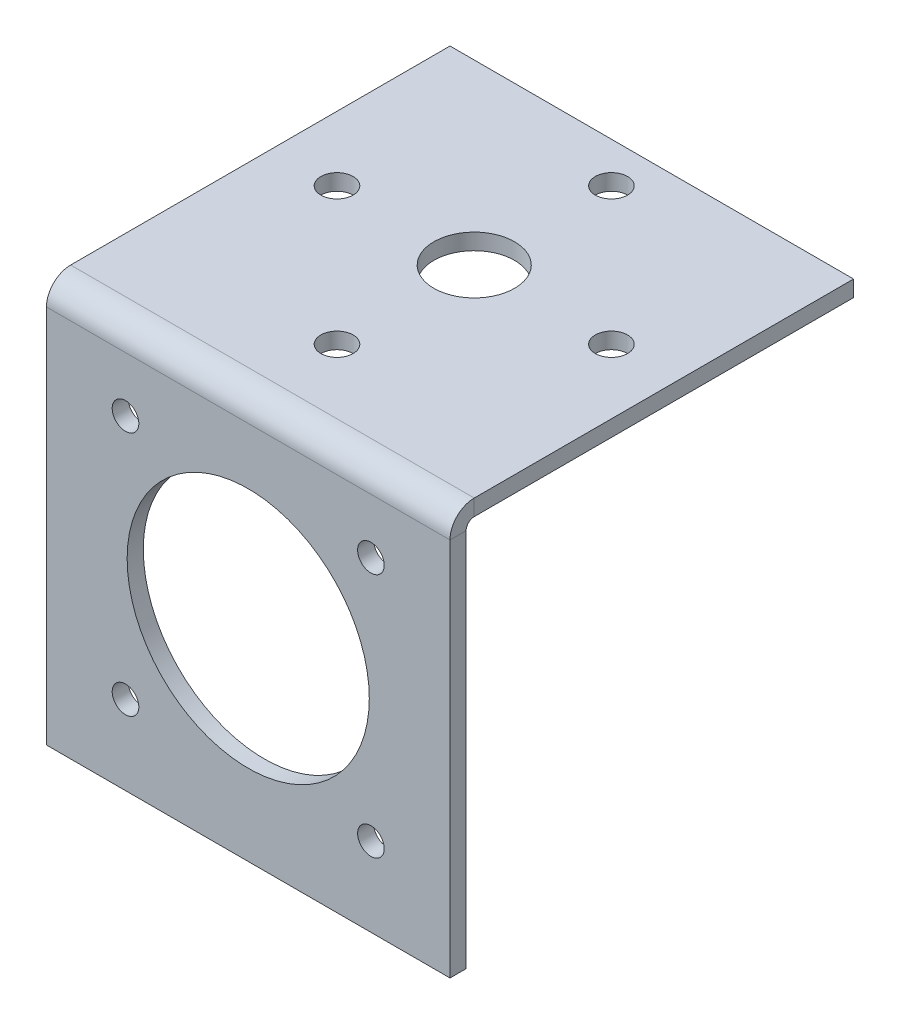
ISO-10303-21;
HEADER;
FILE_DESCRIPTION(('STEP AP214'),'2;1');
FILE_NAME('part.step','',(''),(''),'','','');
FILE_SCHEMA(('AUTOMOTIVE_DESIGN { 1 0 10303 214 1 1 1 1 }'));
ENDSEC;
DATA;
#1=APPLICATION_CONTEXT('core data for automotive mechanical design processes');
#2=APPLICATION_PROTOCOL_DEFINITION('international standard','automotive_design',2000,#1);
#3=PRODUCT_CONTEXT('',#1,'mechanical');
#4=PRODUCT('Part','Part','',(#3));
#5=PRODUCT_RELATED_PRODUCT_CATEGORY('part','',(#4));
#6=PRODUCT_DEFINITION_FORMATION('','',#4);
#7=PRODUCT_DEFINITION_CONTEXT('part definition',#1,'design');
#8=PRODUCT_DEFINITION('design','',#6,#7);
#9=PRODUCT_DEFINITION_SHAPE('','',#8);
#10=(LENGTH_UNIT() NAMED_UNIT(*) SI_UNIT(.MILLI.,.METRE.));
#11=(NAMED_UNIT(*) PLANE_ANGLE_UNIT() SI_UNIT($,.RADIAN.));
#12=(NAMED_UNIT(*) SI_UNIT($,.STERADIAN.) SOLID_ANGLE_UNIT());
#13=UNCERTAINTY_MEASURE_WITH_UNIT(LENGTH_MEASURE(1.E-05),#10,'distance_accuracy_value','');
#14=(GEOMETRIC_REPRESENTATION_CONTEXT(3) GLOBAL_UNCERTAINTY_ASSIGNED_CONTEXT((#13)) GLOBAL_UNIT_ASSIGNED_CONTEXT((#10,
#11,#12)) REPRESENTATION_CONTEXT('',''));
#15=CARTESIAN_POINT('',(0.,0.,0.));
#16=DIRECTION('',(0.,0.,1.));
#17=DIRECTION('',(1.,0.,0.));
#18=AXIS2_PLACEMENT_3D('',#15,#16,#17);
#19=CARTESIAN_POINT('',(25.,-25.,-2.));
#20=DIRECTION('',(1.,0.,0.));
#21=DIRECTION('',(0.,0.,-1.));
#22=AXIS2_PLACEMENT_3D('',#19,#20,#21);
#23=PLANE('',#22);
#24=DIRECTION('',(0.,1.,0.));
#25=VECTOR('',#24,1.);
#26=CARTESIAN_POINT('',(25.,-25.,-2.));
#27=LINE('',#26,#25);
#28=CARTESIAN_POINT('',(25.,-25.,-2.));
#29=VERTEX_POINT('',#28);
#30=CARTESIAN_POINT('',(25.,22.,-2.));
#31=VERTEX_POINT('',#30);
#32=EDGE_CURVE('E197',#29,#31,#27,.T.);
#33=ORIENTED_EDGE('',*,*,#32,.T.);
#34=DIRECTION('',(0.,0.,1.));
#35=VECTOR('',#34,1.);
#36=CARTESIAN_POINT('',(25.,22.,-2.));
#37=LINE('',#36,#35);
#38=CARTESIAN_POINT('',(25.,22.,0.));
#39=VERTEX_POINT('',#38);
#40=EDGE_CURVE('E188',#31,#39,#37,.T.);
#41=ORIENTED_EDGE('',*,*,#40,.T.);
#42=DIRECTION('',(0.,1.,0.));
#43=VECTOR('',#42,1.);
#44=CARTESIAN_POINT('',(25.,-25.,0.));
#45=LINE('',#44,#43);
#46=CARTESIAN_POINT('',(25.,-25.,0.));
#47=VERTEX_POINT('',#46);
#48=EDGE_CURVE('E195',#47,#39,#45,.T.);
#49=ORIENTED_EDGE('',*,*,#48,.F.);
#50=DIRECTION('',(0.,0.,1.));
#51=VECTOR('',#50,1.);
#52=CARTESIAN_POINT('',(25.,-25.,-2.));
#53=LINE('',#52,#51);
#54=EDGE_CURVE('E13',#29,#47,#53,.T.);
#55=ORIENTED_EDGE('',*,*,#54,.F.);
#56=EDGE_LOOP('',(#33,#41,#49,#55));
#57=FACE_BOUND('',#56,.T.);
#58=ADVANCED_FACE('F63',(#57),#23,.T.);
#59=CARTESIAN_POINT('',(0.,0.,-2.));
#60=DIRECTION('',(0.,0.,-1.));
#61=DIRECTION('',(-1.,0.,0.));
#62=AXIS2_PLACEMENT_3D('',#59,#60,#61);
#63=PLANE('',#62);
#64=CARTESIAN_POINT('',(-15.2027957955108,-15.2027957955107,-2.));
#65=DIRECTION('',(0.,0.,-1.));
#66=DIRECTION('',(-1.,0.,0.));
#67=AXIS2_PLACEMENT_3D('',#64,#65,#66);
#68=CIRCLE('',#67,1.65);
#69=CARTESIAN_POINT('',(-16.8527957955108,-15.2027957955107,-2.));
#70=VERTEX_POINT('',#69);
#71=EDGE_CURVE('E185',#70,#70,#68,.T.);
#72=ORIENTED_EDGE('',*,*,#71,.F.);
#73=EDGE_LOOP('',(#72));
#74=FACE_BOUND('',#73,.T.);
#75=CARTESIAN_POINT('',(15.2027957955107,-15.2027957955108,-2.));
#76=DIRECTION('',(0.,0.,-1.));
#77=DIRECTION('',(-1.,0.,0.));
#78=AXIS2_PLACEMENT_3D('',#75,#76,#77);
#79=CIRCLE('',#78,1.65);
#80=CARTESIAN_POINT('',(13.5527957955107,-15.2027957955108,-2.));
#81=VERTEX_POINT('',#80);
#82=EDGE_CURVE('E253',#81,#81,#79,.T.);
#83=ORIENTED_EDGE('',*,*,#82,.F.);
#84=EDGE_LOOP('',(#83));
#85=FACE_BOUND('',#84,.T.);
#86=CARTESIAN_POINT('',(15.2027957955107,15.2027957955108,-2.));
#87=DIRECTION('',(0.,0.,-1.));
#88=DIRECTION('',(-1.,0.,0.));
#89=AXIS2_PLACEMENT_3D('',#86,#87,#88);
#90=CIRCLE('',#89,1.65);
#91=CARTESIAN_POINT('',(13.5527957955107,15.2027957955108,-2.));
#92=VERTEX_POINT('',#91);
#93=EDGE_CURVE('E250',#92,#92,#90,.T.);
#94=ORIENTED_EDGE('',*,*,#93,.F.);
#95=EDGE_LOOP('',(#94));
#96=FACE_BOUND('',#95,.T.);
#97=CARTESIAN_POINT('',(-15.2027957955109,15.2027957955107,-2.));
#98=DIRECTION('',(0.,0.,-1.));
#99=DIRECTION('',(-1.,0.,0.));
#100=AXIS2_PLACEMENT_3D('',#97,#98,#99);
#101=CIRCLE('',#100,1.65);
#102=CARTESIAN_POINT('',(-16.8527957955109,15.2027957955107,-2.));
#103=VERTEX_POINT('',#102);
#104=EDGE_CURVE('E247',#103,#103,#101,.T.);
#105=ORIENTED_EDGE('',*,*,#104,.F.);
#106=EDGE_LOOP('',(#105));
#107=FACE_BOUND('',#106,.T.);
#108=CARTESIAN_POINT('',(0.,0.,-2.));
#109=DIRECTION('',(0.,0.,-1.));
#110=DIRECTION('',(-1.,0.,0.));
#111=AXIS2_PLACEMENT_3D('',#108,#109,#110);
#112=CIRCLE('',#111,15.);
#113=CARTESIAN_POINT('',(-15.,0.,-2.));
#114=VERTEX_POINT('',#113);
#115=EDGE_CURVE('E243',#114,#114,#112,.T.);
#116=ORIENTED_EDGE('',*,*,#115,.F.);
#117=EDGE_LOOP('',(#116));
#118=FACE_BOUND('',#117,.T.);
#119=DIRECTION('',(0.,-1.,0.));
#120=VECTOR('',#119,1.);
#121=CARTESIAN_POINT('',(-25.,-25.,-2.));
#122=LINE('',#121,#120);
#123=CARTESIAN_POINT('',(-25.,22.,-2.));
#124=VERTEX_POINT('',#123);
#125=CARTESIAN_POINT('',(-25.,-25.,-2.));
#126=VERTEX_POINT('',#125);
#127=EDGE_CURVE('E199',#124,#126,#122,.T.);
#128=ORIENTED_EDGE('',*,*,#127,.F.);
#129=DIRECTION('',(1.,0.,0.));
#130=VECTOR('',#129,1.);
#131=CARTESIAN_POINT('',(25.,22.,-2.));
#132=LINE('',#131,#130);
#133=EDGE_CURVE('E86',#31,#124,#132,.F.);
#134=ORIENTED_EDGE('',*,*,#133,.F.);
#135=ORIENTED_EDGE('',*,*,#32,.F.);
#136=DIRECTION('',(1.,0.,0.));
#137=VECTOR('',#136,1.);
#138=CARTESIAN_POINT('',(-25.,-25.,-2.));
#139=LINE('',#138,#137);
#140=EDGE_CURVE('E202',#126,#29,#139,.T.);
#141=ORIENTED_EDGE('',*,*,#140,.F.);
#142=EDGE_LOOP('',(#128,#134,#135,#141));
#143=FACE_BOUND('',#142,.T.);
#144=ADVANCED_FACE('F282',(#74,#85,#96,#107,#118,#143),#63,.T.);
#145=CARTESIAN_POINT('',(0.,0.,0.));
#146=DIRECTION('',(0.,0.,-1.));
#147=DIRECTION('',(-1.,0.,0.));
#148=AXIS2_PLACEMENT_3D('',#145,#146,#147);
#149=PLANE('',#148);
#150=CARTESIAN_POINT('',(-15.2027957955108,-15.2027957955107,0.));
#151=DIRECTION('',(0.,0.,1.));
#152=DIRECTION('',(1.,0.,0.));
#153=AXIS2_PLACEMENT_3D('',#150,#151,#152);
#154=CIRCLE('',#153,1.65);
#155=CARTESIAN_POINT('',(-13.5527957955108,-15.2027957955107,0.));
#156=VERTEX_POINT('',#155);
#157=EDGE_CURVE('E227',#156,#156,#154,.T.);
#158=ORIENTED_EDGE('',*,*,#157,.F.);
#159=EDGE_LOOP('',(#158));
#160=FACE_BOUND('',#159,.T.);
#161=CARTESIAN_POINT('',(15.2027957955107,-15.2027957955108,0.));
#162=DIRECTION('',(0.,0.,1.));
#163=DIRECTION('',(1.,0.,0.));
#164=AXIS2_PLACEMENT_3D('',#161,#162,#163);
#165=CIRCLE('',#164,1.65);
#166=CARTESIAN_POINT('',(16.8527957955107,-15.2027957955108,0.));
#167=VERTEX_POINT('',#166);
#168=EDGE_CURVE('E231',#167,#167,#165,.T.);
#169=ORIENTED_EDGE('',*,*,#168,.F.);
#170=EDGE_LOOP('',(#169));
#171=FACE_BOUND('',#170,.T.);
#172=CARTESIAN_POINT('',(15.2027957955107,15.2027957955108,0.));
#173=DIRECTION('',(0.,0.,1.));
#174=DIRECTION('',(1.,0.,0.));
#175=AXIS2_PLACEMENT_3D('',#172,#173,#174);
#176=CIRCLE('',#175,1.65);
#177=CARTESIAN_POINT('',(16.8527957955107,15.2027957955108,0.));
#178=VERTEX_POINT('',#177);
#179=EDGE_CURVE('E236',#178,#178,#176,.T.);
#180=ORIENTED_EDGE('',*,*,#179,.F.);
#181=EDGE_LOOP('',(#180));
#182=FACE_BOUND('',#181,.T.);
#183=CARTESIAN_POINT('',(-15.2027957955109,15.2027957955107,0.));
#184=DIRECTION('',(0.,0.,1.));
#185=DIRECTION('',(1.,0.,0.));
#186=AXIS2_PLACEMENT_3D('',#183,#184,#185);
#187=CIRCLE('',#186,1.65);
#188=CARTESIAN_POINT('',(-13.5527957955109,15.2027957955107,0.));
#189=VERTEX_POINT('',#188);
#190=EDGE_CURVE('E244',#189,#189,#187,.T.);
#191=ORIENTED_EDGE('',*,*,#190,.F.);
#192=EDGE_LOOP('',(#191));
#193=FACE_BOUND('',#192,.T.);
#194=CARTESIAN_POINT('',(0.,0.,0.));
#195=DIRECTION('',(0.,0.,1.));
#196=DIRECTION('',(1.,0.,0.));
#197=AXIS2_PLACEMENT_3D('',#194,#195,#196);
#198=CIRCLE('',#197,15.);
#199=CARTESIAN_POINT('',(15.,0.,0.));
#200=VERTEX_POINT('',#199);
#201=EDGE_CURVE('E240',#200,#200,#198,.T.);
#202=ORIENTED_EDGE('',*,*,#201,.F.);
#203=EDGE_LOOP('',(#202));
#204=FACE_BOUND('',#203,.T.);
#205=DIRECTION('',(1.,0.,0.));
#206=VECTOR('',#205,1.);
#207=CARTESIAN_POINT('',(25.,22.,0.));
#208=LINE('',#207,#206);
#209=CARTESIAN_POINT('',(-25.,22.,0.));
#210=VERTEX_POINT('',#209);
#211=EDGE_CURVE('E137',#39,#210,#208,.F.);
#212=ORIENTED_EDGE('',*,*,#211,.T.);
#213=DIRECTION('',(0.,-1.,0.));
#214=VECTOR('',#213,1.);
#215=CARTESIAN_POINT('',(-25.,-25.,0.));
#216=LINE('',#215,#214);
#217=CARTESIAN_POINT('',(-25.,-25.,0.));
#218=VERTEX_POINT('',#217);
#219=EDGE_CURVE('E207',#210,#218,#216,.T.);
#220=ORIENTED_EDGE('',*,*,#219,.T.);
#221=DIRECTION('',(1.,0.,0.));
#222=VECTOR('',#221,1.);
#223=CARTESIAN_POINT('',(-25.,-25.,0.));
#224=LINE('',#223,#222);
#225=EDGE_CURVE('E200',#218,#47,#224,.T.);
#226=ORIENTED_EDGE('',*,*,#225,.T.);
#227=ORIENTED_EDGE('',*,*,#48,.T.);
#228=EDGE_LOOP('',(#212,#220,#226,#227));
#229=FACE_BOUND('',#228,.T.);
#230=ADVANCED_FACE('F289',(#160,#171,#182,#193,#204,#229),#149,.F.);
#231=CARTESIAN_POINT('',(-25.,-25.,-2.));
#232=DIRECTION('',(0.,-1.,0.));
#233=DIRECTION('',(0.,0.,-1.));
#234=AXIS2_PLACEMENT_3D('',#231,#232,#233);
#235=PLANE('',#234);
#236=ORIENTED_EDGE('',*,*,#225,.F.);
#237=DIRECTION('',(0.,0.,1.));
#238=VECTOR('',#237,1.);
#239=CARTESIAN_POINT('',(-25.,-25.,-2.));
#240=LINE('',#239,#238);
#241=EDGE_CURVE('E71',#126,#218,#240,.T.);
#242=ORIENTED_EDGE('',*,*,#241,.F.);
#243=ORIENTED_EDGE('',*,*,#140,.T.);
#244=ORIENTED_EDGE('',*,*,#54,.T.);
#245=EDGE_LOOP('',(#236,#242,#243,#244));
#246=FACE_BOUND('',#245,.T.);
#247=ADVANCED_FACE('F297',(#246),#235,.T.);
#248=CARTESIAN_POINT('',(-25.,-25.,-2.));
#249=DIRECTION('',(-1.,0.,0.));
#250=DIRECTION('',(0.,0.,1.));
#251=AXIS2_PLACEMENT_3D('',#248,#249,#250);
#252=PLANE('',#251);
#253=DIRECTION('',(0.,0.,1.));
#254=VECTOR('',#253,1.);
#255=CARTESIAN_POINT('',(-25.,22.,-2.));
#256=LINE('',#255,#254);
#257=EDGE_CURVE('E79',#124,#210,#256,.T.);
#258=ORIENTED_EDGE('',*,*,#257,.F.);
#259=ORIENTED_EDGE('',*,*,#127,.T.);
#260=ORIENTED_EDGE('',*,*,#241,.T.);
#261=ORIENTED_EDGE('',*,*,#219,.F.);
#262=EDGE_LOOP('',(#258,#259,#260,#261));
#263=FACE_BOUND('',#262,.T.);
#264=ADVANCED_FACE('F298',(#263),#252,.T.);
#265=CARTESIAN_POINT('',(-25.,22.,-3.));
#266=DIRECTION('',(-1.,0.,0.));
#267=DIRECTION('',(0.,0.,1.));
#268=AXIS2_PLACEMENT_3D('',#265,#266,#267);
#269=PLANE('',#268);
#270=DIRECTION('',(0.,1.,0.));
#271=VECTOR('',#270,1.);
#272=CARTESIAN_POINT('',(-25.,25.,-2.99999999999999));
#273=LINE('',#272,#271);
#274=CARTESIAN_POINT('',(-25.,23.,-3.));
#275=VERTEX_POINT('',#274);
#276=CARTESIAN_POINT('',(-25.,25.,-2.99999999999999));
#277=VERTEX_POINT('',#276);
#278=EDGE_CURVE('E182',#275,#277,#273,.T.);
#279=ORIENTED_EDGE('',*,*,#278,.F.);
#280=CARTESIAN_POINT('',(-25.,22.,-3.));
#281=DIRECTION('',(1.,0.,0.));
#282=DIRECTION('',(0.,0.,-1.));
#283=AXIS2_PLACEMENT_3D('',#280,#281,#282);
#284=CIRCLE('',#283,1.);
#285=EDGE_CURVE('E140',#124,#275,#284,.F.);
#286=ORIENTED_EDGE('',*,*,#285,.F.);
#287=ORIENTED_EDGE('',*,*,#257,.T.);
#288=CARTESIAN_POINT('',(-25.,22.,-3.));
#289=DIRECTION('',(1.,0.,0.));
#290=DIRECTION('',(0.,0.,-1.));
#291=AXIS2_PLACEMENT_3D('',#288,#289,#290);
#292=CIRCLE('',#291,3.);
#293=EDGE_CURVE('E187',#210,#277,#292,.F.);
#294=ORIENTED_EDGE('',*,*,#293,.T.);
#295=EDGE_LOOP('',(#279,#286,#287,#294));
#296=FACE_BOUND('',#295,.T.);
#297=ADVANCED_FACE('F269',(#296),#269,.T.);
#298=CARTESIAN_POINT('',(25.,22.,-3.));
#299=DIRECTION('',(-1.,0.,0.));
#300=DIRECTION('',(0.,0.,1.));
#301=AXIS2_PLACEMENT_3D('',#298,#299,#300);
#302=PLANE('',#301);
#303=CARTESIAN_POINT('',(25.,22.,-3.));
#304=DIRECTION('',(1.,0.,0.));
#305=DIRECTION('',(0.,0.,-1.));
#306=AXIS2_PLACEMENT_3D('',#303,#304,#305);
#307=CIRCLE('',#306,1.);
#308=CARTESIAN_POINT('',(25.,23.,-3.));
#309=VERTEX_POINT('',#308);
#310=EDGE_CURVE('E147',#309,#31,#307,.T.);
#311=ORIENTED_EDGE('',*,*,#310,.F.);
#312=DIRECTION('',(0.,1.,0.));
#313=VECTOR('',#312,1.);
#314=CARTESIAN_POINT('',(25.,23.,-3.));
#315=LINE('',#314,#313);
#316=CARTESIAN_POINT('',(25.,25.,-2.99999999999999));
#317=VERTEX_POINT('',#316);
#318=EDGE_CURVE('E144',#309,#317,#315,.T.);
#319=ORIENTED_EDGE('',*,*,#318,.T.);
#320=CARTESIAN_POINT('',(25.,22.,-3.));
#321=DIRECTION('',(1.,0.,0.));
#322=DIRECTION('',(0.,0.,-1.));
#323=AXIS2_PLACEMENT_3D('',#320,#321,#322);
#324=CIRCLE('',#323,3.);
#325=EDGE_CURVE('E130',#317,#39,#324,.T.);
#326=ORIENTED_EDGE('',*,*,#325,.T.);
#327=ORIENTED_EDGE('',*,*,#40,.F.);
#328=EDGE_LOOP('',(#311,#319,#326,#327));
#329=FACE_BOUND('',#328,.T.);
#330=ADVANCED_FACE('F145',(#329),#302,.F.);
#331=CARTESIAN_POINT('',(25.,22.,-3.));
#332=DIRECTION('',(1.,0.,0.));
#333=DIRECTION('',(0.,1.,0.));
#334=AXIS2_PLACEMENT_3D('',#331,#332,#333);
#335=CYLINDRICAL_SURFACE('',#334,3.);
#336=ORIENTED_EDGE('',*,*,#211,.F.);
#337=ORIENTED_EDGE('',*,*,#325,.F.);
#338=DIRECTION('',(1.,0.,0.));
#339=VECTOR('',#338,1.);
#340=CARTESIAN_POINT('',(0.,25.,-2.99999999999999));
#341=LINE('',#340,#339);
#342=EDGE_CURVE('E135',#277,#317,#341,.T.);
#343=ORIENTED_EDGE('',*,*,#342,.F.);
#344=ORIENTED_EDGE('',*,*,#293,.F.);
#345=EDGE_LOOP('',(#336,#337,#343,#344));
#346=FACE_BOUND('',#345,.T.);
#347=ADVANCED_FACE('F132',(#346),#335,.T.);
#348=CARTESIAN_POINT('',(25.,22.,-3.));
#349=DIRECTION('',(1.,0.,0.));
#350=DIRECTION('',(0.,1.,0.));
#351=AXIS2_PLACEMENT_3D('',#348,#349,#350);
#352=CYLINDRICAL_SURFACE('',#351,1.);
#353=ORIENTED_EDGE('',*,*,#133,.T.);
#354=ORIENTED_EDGE('',*,*,#285,.T.);
#355=DIRECTION('',(-1.,0.,0.));
#356=VECTOR('',#355,1.);
#357=CARTESIAN_POINT('',(-25.,23.,-3.));
#358=LINE('',#357,#356);
#359=EDGE_CURVE('E152',#275,#309,#358,.F.);
#360=ORIENTED_EDGE('',*,*,#359,.T.);
#361=ORIENTED_EDGE('',*,*,#310,.T.);
#362=EDGE_LOOP('',(#353,#354,#360,#361));
#363=FACE_BOUND('',#362,.T.);
#364=ADVANCED_FACE('F271',(#363),#352,.F.);
#365=CARTESIAN_POINT('',(25.,25.,-1.99999999999999));
#366=DIRECTION('',(1.,0.,0.));
#367=DIRECTION('',(0.,0.,-1.));
#368=AXIS2_PLACEMENT_3D('',#365,#366,#367);
#369=PLANE('',#368);
#370=DIRECTION('',(0.,0.,1.));
#371=VECTOR('',#370,1.);
#372=CARTESIAN_POINT('',(25.,25.,-1.99999999999999));
#373=LINE('',#372,#371);
#374=CARTESIAN_POINT('',(25.,25.0000000000002,-50.));
#375=VERTEX_POINT('',#374);
#376=EDGE_CURVE('E159',#375,#317,#373,.T.);
#377=ORIENTED_EDGE('',*,*,#376,.T.);
#378=ORIENTED_EDGE('',*,*,#318,.F.);
#379=DIRECTION('',(0.,0.,-1.));
#380=VECTOR('',#379,1.);
#381=CARTESIAN_POINT('',(25.,23.,0.));
#382=LINE('',#381,#380);
#383=CARTESIAN_POINT('',(25.,23.0000000000002,-50.));
#384=VERTEX_POINT('',#383);
#385=EDGE_CURVE('E175',#384,#309,#382,.F.);
#386=ORIENTED_EDGE('',*,*,#385,.F.);
#387=DIRECTION('',(0.,-1.,0.));
#388=VECTOR('',#387,1.);
#389=CARTESIAN_POINT('',(25.,25.0000000000002,-50.));
#390=LINE('',#389,#388);
#391=EDGE_CURVE('E164',#375,#384,#390,.T.);
#392=ORIENTED_EDGE('',*,*,#391,.F.);
#393=EDGE_LOOP('',(#377,#378,#386,#392));
#394=FACE_BOUND('',#393,.T.);
#395=ADVANCED_FACE('F163',(#394),#369,.T.);
#396=CARTESIAN_POINT('',(-25.,25.0000000000002,-50.));
#397=DIRECTION('',(-1.,0.,0.));
#398=DIRECTION('',(0.,0.,1.));
#399=AXIS2_PLACEMENT_3D('',#396,#397,#398);
#400=PLANE('',#399);
#401=DIRECTION('',(0.,0.,1.));
#402=VECTOR('',#401,1.);
#403=CARTESIAN_POINT('',(-25.,23.,0.));
#404=LINE('',#403,#402);
#405=CARTESIAN_POINT('',(-25.,23.0000000000002,-50.));
#406=VERTEX_POINT('',#405);
#407=EDGE_CURVE('E161',#275,#406,#404,.F.);
#408=ORIENTED_EDGE('',*,*,#407,.F.);
#409=ORIENTED_EDGE('',*,*,#278,.T.);
#410=DIRECTION('',(0.,0.,-1.));
#411=VECTOR('',#410,1.);
#412=CARTESIAN_POINT('',(-25.,25.0000000000002,-50.));
#413=LINE('',#412,#411);
#414=CARTESIAN_POINT('',(-25.,25.0000000000002,-50.));
#415=VERTEX_POINT('',#414);
#416=EDGE_CURVE('E160',#277,#415,#413,.T.);
#417=ORIENTED_EDGE('',*,*,#416,.T.);
#418=DIRECTION('',(0.,-1.,0.));
#419=VECTOR('',#418,1.);
#420=CARTESIAN_POINT('',(-25.,25.0000000000002,-50.));
#421=LINE('',#420,#419);
#422=EDGE_CURVE('E166',#415,#406,#421,.T.);
#423=ORIENTED_EDGE('',*,*,#422,.T.);
#424=EDGE_LOOP('',(#408,#409,#417,#423));
#425=FACE_BOUND('',#424,.T.);
#426=ADVANCED_FACE('F266',(#425),#400,.T.);
#427=CARTESIAN_POINT('',(0.,25.,0.));
#428=DIRECTION('',(0.,1.,0.));
#429=DIRECTION('',(0.,0.,1.));
#430=AXIS2_PLACEMENT_3D('',#427,#428,#429);
#431=PLANE('',#430);
#432=CARTESIAN_POINT('',(0.,25.0000000000001,-45.));
#433=DIRECTION('',(0.,1.,0.));
#434=DIRECTION('',(0.,0.,1.));
#435=AXIS2_PLACEMENT_3D('',#432,#433,#434);
#436=CIRCLE('',#435,2.);
#437=CARTESIAN_POINT('',(0.,25.0000000000001,-43.));
#438=VERTEX_POINT('',#437);
#439=EDGE_CURVE('E548',#438,#438,#436,.T.);
#440=ORIENTED_EDGE('',*,*,#439,.F.);
#441=EDGE_LOOP('',(#440));
#442=FACE_BOUND('',#441,.T.);
#443=CARTESIAN_POINT('',(17.0000000000039,25.0000000000001,-28.0000000000037));
#444=DIRECTION('',(0.,1.,0.));
#445=DIRECTION('',(0.,0.,1.));
#446=AXIS2_PLACEMENT_3D('',#443,#444,#445);
#447=CIRCLE('',#446,2.);
#448=CARTESIAN_POINT('',(17.0000000000039,25.0000000000001,-26.0000000000037));
#449=VERTEX_POINT('',#448);
#450=EDGE_CURVE('E549',#449,#449,#447,.T.);
#451=ORIENTED_EDGE('',*,*,#450,.F.);
#452=EDGE_LOOP('',(#451));
#453=FACE_BOUND('',#452,.T.);
#454=CARTESIAN_POINT('',(7.54327086877545E-12,25.,-10.9999999999998));
#455=DIRECTION('',(0.,1.,0.));
#456=DIRECTION('',(0.,0.,1.));
#457=AXIS2_PLACEMENT_3D('',#454,#455,#456);
#458=CIRCLE('',#457,2.);
#459=CARTESIAN_POINT('',(7.54327086877545E-12,25.,-8.99999999999983));
#460=VERTEX_POINT('',#459);
#461=EDGE_CURVE('E554',#460,#460,#458,.T.);
#462=ORIENTED_EDGE('',*,*,#461,.F.);
#463=EDGE_LOOP('',(#462));
#464=FACE_BOUND('',#463,.T.);
#465=CARTESIAN_POINT('',(-16.9999999999963,25.0000000000001,-27.9999999999963));
#466=DIRECTION('',(0.,1.,0.));
#467=DIRECTION('',(0.,0.,1.));
#468=AXIS2_PLACEMENT_3D('',#465,#466,#467);
#469=CIRCLE('',#468,2.);
#470=CARTESIAN_POINT('',(-16.9999999999963,25.0000000000001,-25.9999999999963));
#471=VERTEX_POINT('',#470);
#472=EDGE_CURVE('E557',#471,#471,#469,.T.);
#473=ORIENTED_EDGE('',*,*,#472,.F.);
#474=EDGE_LOOP('',(#473));
#475=FACE_BOUND('',#474,.T.);
#476=CARTESIAN_POINT('',(0.,25.0000000000001,-28.));
#477=DIRECTION('',(0.,1.,0.));
#478=DIRECTION('',(0.,0.,1.));
#479=AXIS2_PLACEMENT_3D('',#476,#477,#478);
#480=CIRCLE('',#479,5.);
#481=CARTESIAN_POINT('',(0.,25.0000000000001,-23.));
#482=VERTEX_POINT('',#481);
#483=EDGE_CURVE('E217',#482,#482,#480,.T.);
#484=ORIENTED_EDGE('',*,*,#483,.F.);
#485=EDGE_LOOP('',(#484));
#486=FACE_BOUND('',#485,.T.);
#487=ORIENTED_EDGE('',*,*,#416,.F.);
#488=ORIENTED_EDGE('',*,*,#342,.T.);
#489=ORIENTED_EDGE('',*,*,#376,.F.);
#490=DIRECTION('',(1.,0.,0.));
#491=VECTOR('',#490,1.);
#492=CARTESIAN_POINT('',(25.,25.0000000000002,-50.));
#493=LINE('',#492,#491);
#494=EDGE_CURVE('E167',#415,#375,#493,.T.);
#495=ORIENTED_EDGE('',*,*,#494,.F.);
#496=EDGE_LOOP('',(#487,#488,#489,#495));
#497=FACE_BOUND('',#496,.T.);
#498=ADVANCED_FACE('F157',(#442,#453,#464,#475,#486,#497),#431,.T.);
#499=CARTESIAN_POINT('',(0.,23.,0.));
#500=DIRECTION('',(0.,1.,0.));
#501=DIRECTION('',(0.,0.,1.));
#502=AXIS2_PLACEMENT_3D('',#499,#500,#501);
#503=PLANE('',#502);
#504=CARTESIAN_POINT('',(0.,23.0000000000002,-45.));
#505=DIRECTION('',(0.,1.,0.));
#506=DIRECTION('',(0.,0.,1.));
#507=AXIS2_PLACEMENT_3D('',#504,#505,#506);
#508=CIRCLE('',#507,2.);
#509=CARTESIAN_POINT('',(0.,23.0000000000001,-43.));
#510=VERTEX_POINT('',#509);
#511=EDGE_CURVE('E66',#510,#510,#508,.T.);
#512=ORIENTED_EDGE('',*,*,#511,.T.);
#513=EDGE_LOOP('',(#512));
#514=FACE_BOUND('',#513,.T.);
#515=CARTESIAN_POINT('',(17.0000000000039,23.0000000000001,-28.0000000000037));
#516=DIRECTION('',(0.,1.,0.));
#517=DIRECTION('',(0.,0.,1.));
#518=AXIS2_PLACEMENT_3D('',#515,#516,#517);
#519=CIRCLE('',#518,2.);
#520=CARTESIAN_POINT('',(17.0000000000039,23.0000000000001,-26.0000000000037));
#521=VERTEX_POINT('',#520);
#522=EDGE_CURVE('E222',#521,#521,#519,.T.);
#523=ORIENTED_EDGE('',*,*,#522,.T.);
#524=EDGE_LOOP('',(#523));
#525=FACE_BOUND('',#524,.T.);
#526=CARTESIAN_POINT('',(7.54327086877545E-12,23.,-10.9999999999998));
#527=DIRECTION('',(0.,1.,0.));
#528=DIRECTION('',(0.,0.,1.));
#529=AXIS2_PLACEMENT_3D('',#526,#527,#528);
#530=CIRCLE('',#529,2.);
#531=CARTESIAN_POINT('',(7.54327086877545E-12,23.,-8.99999999999984));
#532=VERTEX_POINT('',#531);
#533=EDGE_CURVE('E220',#532,#532,#530,.T.);
#534=ORIENTED_EDGE('',*,*,#533,.T.);
#535=EDGE_LOOP('',(#534));
#536=FACE_BOUND('',#535,.T.);
#537=CARTESIAN_POINT('',(-16.9999999999963,23.0000000000001,-27.9999999999963));
#538=DIRECTION('',(0.,1.,0.));
#539=DIRECTION('',(0.,0.,1.));
#540=AXIS2_PLACEMENT_3D('',#537,#538,#539);
#541=CIRCLE('',#540,2.);
#542=CARTESIAN_POINT('',(-16.9999999999963,23.0000000000001,-25.9999999999963));
#543=VERTEX_POINT('',#542);
#544=EDGE_CURVE('E216',#543,#543,#541,.T.);
#545=ORIENTED_EDGE('',*,*,#544,.T.);
#546=EDGE_LOOP('',(#545));
#547=FACE_BOUND('',#546,.T.);
#548=CARTESIAN_POINT('',(0.,23.0000000000001,-28.));
#549=DIRECTION('',(0.,1.,0.));
#550=DIRECTION('',(0.,0.,1.));
#551=AXIS2_PLACEMENT_3D('',#548,#549,#550);
#552=CIRCLE('',#551,5.);
#553=CARTESIAN_POINT('',(0.,23.0000000000001,-23.));
#554=VERTEX_POINT('',#553);
#555=EDGE_CURVE('E213',#554,#554,#552,.T.);
#556=ORIENTED_EDGE('',*,*,#555,.T.);
#557=EDGE_LOOP('',(#556));
#558=FACE_BOUND('',#557,.T.);
#559=ORIENTED_EDGE('',*,*,#359,.F.);
#560=ORIENTED_EDGE('',*,*,#407,.T.);
#561=DIRECTION('',(-1.,0.,0.));
#562=VECTOR('',#561,1.);
#563=CARTESIAN_POINT('',(0.,23.0000000000002,-50.));
#564=LINE('',#563,#562);
#565=EDGE_CURVE('E177',#406,#384,#564,.F.);
#566=ORIENTED_EDGE('',*,*,#565,.T.);
#567=ORIENTED_EDGE('',*,*,#385,.T.);
#568=EDGE_LOOP('',(#559,#560,#566,#567));
#569=FACE_BOUND('',#568,.T.);
#570=ADVANCED_FACE('F263',(#514,#525,#536,#547,#558,#569),#503,.F.);
#571=CARTESIAN_POINT('',(25.,25.0000000000002,-50.));
#572=DIRECTION('',(0.,0.,-1.));
#573=DIRECTION('',(0.,1.,0.));
#574=AXIS2_PLACEMENT_3D('',#571,#572,#573);
#575=PLANE('',#574);
#576=ORIENTED_EDGE('',*,*,#565,.F.);
#577=ORIENTED_EDGE('',*,*,#422,.F.);
#578=ORIENTED_EDGE('',*,*,#494,.T.);
#579=ORIENTED_EDGE('',*,*,#391,.T.);
#580=EDGE_LOOP('',(#576,#577,#578,#579));
#581=FACE_BOUND('',#580,.T.);
#582=ADVANCED_FACE('F259',(#581),#575,.T.);
#583=CARTESIAN_POINT('',(0.,0.,-10.));
#584=DIRECTION('',(0.,0.,1.));
#585=DIRECTION('',(1.,0.,0.));
#586=AXIS2_PLACEMENT_3D('',#583,#584,#585);
#587=CYLINDRICAL_SURFACE('',#586,15.);
#588=ORIENTED_EDGE('',*,*,#115,.T.);
#589=EDGE_LOOP('',(#588));
#590=FACE_BOUND('',#589,.T.);
#591=ORIENTED_EDGE('',*,*,#201,.T.);
#592=EDGE_LOOP('',(#591));
#593=FACE_BOUND('',#592,.T.);
#594=ADVANCED_FACE('F375',(#590,#593),#587,.F.);
#595=CARTESIAN_POINT('',(-15.2027957955109,15.2027957955107,-10.));
#596=DIRECTION('',(0.,0.,1.));
#597=DIRECTION('',(1.,0.,0.));
#598=AXIS2_PLACEMENT_3D('',#595,#596,#597);
#599=CYLINDRICAL_SURFACE('',#598,1.65);
#600=ORIENTED_EDGE('',*,*,#104,.T.);
#601=EDGE_LOOP('',(#600));
#602=FACE_BOUND('',#601,.T.);
#603=ORIENTED_EDGE('',*,*,#190,.T.);
#604=EDGE_LOOP('',(#603));
#605=FACE_BOUND('',#604,.T.);
#606=ADVANCED_FACE('F384',(#602,#605),#599,.F.);
#607=CARTESIAN_POINT('',(15.2027957955107,15.2027957955108,-10.));
#608=DIRECTION('',(0.,0.,1.));
#609=DIRECTION('',(1.,0.,0.));
#610=AXIS2_PLACEMENT_3D('',#607,#608,#609);
#611=CYLINDRICAL_SURFACE('',#610,1.65);
#612=ORIENTED_EDGE('',*,*,#93,.T.);
#613=EDGE_LOOP('',(#612));
#614=FACE_BOUND('',#613,.T.);
#615=ORIENTED_EDGE('',*,*,#179,.T.);
#616=EDGE_LOOP('',(#615));
#617=FACE_BOUND('',#616,.T.);
#618=ADVANCED_FACE('F395',(#614,#617),#611,.F.);
#619=CARTESIAN_POINT('',(15.2027957955107,-15.2027957955108,-10.));
#620=DIRECTION('',(0.,0.,1.));
#621=DIRECTION('',(1.,0.,0.));
#622=AXIS2_PLACEMENT_3D('',#619,#620,#621);
#623=CYLINDRICAL_SURFACE('',#622,1.65);
#624=ORIENTED_EDGE('',*,*,#82,.T.);
#625=EDGE_LOOP('',(#624));
#626=FACE_BOUND('',#625,.T.);
#627=ORIENTED_EDGE('',*,*,#168,.T.);
#628=EDGE_LOOP('',(#627));
#629=FACE_BOUND('',#628,.T.);
#630=ADVANCED_FACE('F406',(#626,#629),#623,.F.);
#631=CARTESIAN_POINT('',(-15.2027957955108,-15.2027957955107,-10.));
#632=DIRECTION('',(0.,0.,1.));
#633=DIRECTION('',(1.,0.,0.));
#634=AXIS2_PLACEMENT_3D('',#631,#632,#633);
#635=CYLINDRICAL_SURFACE('',#634,1.65);
#636=ORIENTED_EDGE('',*,*,#71,.T.);
#637=EDGE_LOOP('',(#636));
#638=FACE_BOUND('',#637,.T.);
#639=ORIENTED_EDGE('',*,*,#157,.T.);
#640=EDGE_LOOP('',(#639));
#641=FACE_BOUND('',#640,.T.);
#642=ADVANCED_FACE('F417',(#638,#641),#635,.F.);
#643=CARTESIAN_POINT('',(0.,15.0000000000001,-28.));
#644=DIRECTION('',(0.,1.,0.));
#645=DIRECTION('',(0.,0.,1.));
#646=AXIS2_PLACEMENT_3D('',#643,#644,#645);
#647=CYLINDRICAL_SURFACE('',#646,5.);
#648=ORIENTED_EDGE('',*,*,#483,.T.);
#649=EDGE_LOOP('',(#648));
#650=FACE_BOUND('',#649,.T.);
#651=ORIENTED_EDGE('',*,*,#555,.F.);
#652=EDGE_LOOP('',(#651));
#653=FACE_BOUND('',#652,.T.);
#654=ADVANCED_FACE('F427',(#650,#653),#647,.F.);
#655=CARTESIAN_POINT('',(-16.9999999999963,15.0000000000001,-27.9999999999963));
#656=DIRECTION('',(0.,1.,0.));
#657=DIRECTION('',(0.,0.,1.));
#658=AXIS2_PLACEMENT_3D('',#655,#656,#657);
#659=CYLINDRICAL_SURFACE('',#658,2.);
#660=ORIENTED_EDGE('',*,*,#472,.T.);
#661=EDGE_LOOP('',(#660));
#662=FACE_BOUND('',#661,.T.);
#663=ORIENTED_EDGE('',*,*,#544,.F.);
#664=EDGE_LOOP('',(#663));
#665=FACE_BOUND('',#664,.T.);
#666=ADVANCED_FACE('F437',(#662,#665),#659,.F.);
#667=CARTESIAN_POINT('',(7.54327086877545E-12,15.,-10.9999999999999));
#668=DIRECTION('',(0.,1.,0.));
#669=DIRECTION('',(0.,0.,1.));
#670=AXIS2_PLACEMENT_3D('',#667,#668,#669);
#671=CYLINDRICAL_SURFACE('',#670,2.);
#672=ORIENTED_EDGE('',*,*,#461,.T.);
#673=EDGE_LOOP('',(#672));
#674=FACE_BOUND('',#673,.T.);
#675=ORIENTED_EDGE('',*,*,#533,.F.);
#676=EDGE_LOOP('',(#675));
#677=FACE_BOUND('',#676,.T.);
#678=ADVANCED_FACE('F448',(#674,#677),#671,.F.);
#679=CARTESIAN_POINT('',(17.0000000000039,15.0000000000001,-28.0000000000037));
#680=DIRECTION('',(0.,1.,0.));
#681=DIRECTION('',(0.,0.,1.));
#682=AXIS2_PLACEMENT_3D('',#679,#680,#681);
#683=CYLINDRICAL_SURFACE('',#682,2.);
#684=ORIENTED_EDGE('',*,*,#450,.T.);
#685=EDGE_LOOP('',(#684));
#686=FACE_BOUND('',#685,.T.);
#687=ORIENTED_EDGE('',*,*,#522,.F.);
#688=EDGE_LOOP('',(#687));
#689=FACE_BOUND('',#688,.T.);
#690=ADVANCED_FACE('F459',(#686,#689),#683,.F.);
#691=CARTESIAN_POINT('',(0.,15.0000000000002,-45.));
#692=DIRECTION('',(0.,1.,0.));
#693=DIRECTION('',(0.,0.,1.));
#694=AXIS2_PLACEMENT_3D('',#691,#692,#693);
#695=CYLINDRICAL_SURFACE('',#694,2.);
#696=ORIENTED_EDGE('',*,*,#439,.T.);
#697=EDGE_LOOP('',(#696));
#698=FACE_BOUND('',#697,.T.);
#699=ORIENTED_EDGE('',*,*,#511,.F.);
#700=EDGE_LOOP('',(#699));
#701=FACE_BOUND('',#700,.T.);
#702=ADVANCED_FACE('F470',(#698,#701),#695,.F.);
#703=CLOSED_SHELL('',(#58,#144,#230,#247,#264,#297,#330,#347,#364,#395,#426,#498,#570,#582,#594,
#606,#618,#630,#642,#654,#666,#678,#690,#702));
#704=MANIFOLD_SOLID_BREP('B2',#703);
#705=ADVANCED_BREP_SHAPE_REPRESENTATION('',(#18,#704),#14);
#706=SHAPE_DEFINITION_REPRESENTATION(#9,#705);
ENDSEC;
END-ISO-10303-21;
